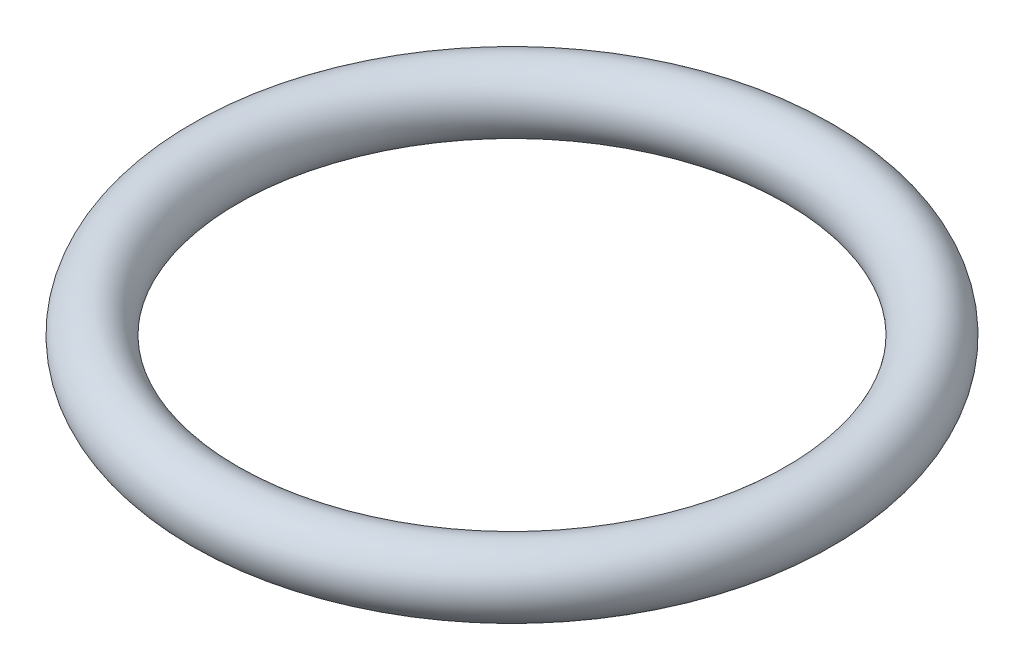
ISO-10303-21;
HEADER;
FILE_DESCRIPTION(('STEP AP214'),'2;1');
FILE_NAME('part.step','',(''),(''),'','','');
FILE_SCHEMA(('AUTOMOTIVE_DESIGN { 1 0 10303 214 1 1 1 1 }'));
ENDSEC;
DATA;
#1=APPLICATION_CONTEXT('core data for automotive mechanical design processes');
#2=APPLICATION_PROTOCOL_DEFINITION('international standard','automotive_design',2000,#1);
#3=PRODUCT_CONTEXT('',#1,'mechanical');
#4=PRODUCT('Part','Part','',(#3));
#5=PRODUCT_RELATED_PRODUCT_CATEGORY('part','',(#4));
#6=PRODUCT_DEFINITION_FORMATION('','',#4);
#7=PRODUCT_DEFINITION_CONTEXT('part definition',#1,'design');
#8=PRODUCT_DEFINITION('design','',#6,#7);
#9=PRODUCT_DEFINITION_SHAPE('','',#8);
#10=(LENGTH_UNIT() NAMED_UNIT(*) SI_UNIT(.MILLI.,.METRE.));
#11=(NAMED_UNIT(*) PLANE_ANGLE_UNIT() SI_UNIT($,.RADIAN.));
#12=(NAMED_UNIT(*) SI_UNIT($,.STERADIAN.) SOLID_ANGLE_UNIT());
#13=UNCERTAINTY_MEASURE_WITH_UNIT(LENGTH_MEASURE(1.E-05),#10,'distance_accuracy_value','');
#14=(GEOMETRIC_REPRESENTATION_CONTEXT(3) GLOBAL_UNCERTAINTY_ASSIGNED_CONTEXT((#13)) GLOBAL_UNIT_ASSIGNED_CONTEXT((#10,
#11,#12)) REPRESENTATION_CONTEXT('',''));
#15=CARTESIAN_POINT('',(0.,0.,0.));
#16=DIRECTION('',(0.,0.,1.));
#17=DIRECTION('',(1.,0.,0.));
#18=AXIS2_PLACEMENT_3D('',#15,#16,#17);
#19=CARTESIAN_POINT('',(0.,0.,0.));
#20=DIRECTION('',(0.,-1.,0.));
#21=DIRECTION('',(0.,0.,-1.));
#22=AXIS2_PLACEMENT_3D('',#19,#20,#21);
#23=TOROIDAL_SURFACE('',#22,3.605,0.395);
#24=ADVANCED_FACE('F13',(),#23,.T.);
#25=CLOSED_SHELL('',(#24));
#26=MANIFOLD_SOLID_BREP('B1',#25);
#27=ADVANCED_BREP_SHAPE_REPRESENTATION('',(#18,#26),#14);
#28=SHAPE_DEFINITION_REPRESENTATION(#9,#27);
ENDSEC;
END-ISO-10303-21;
